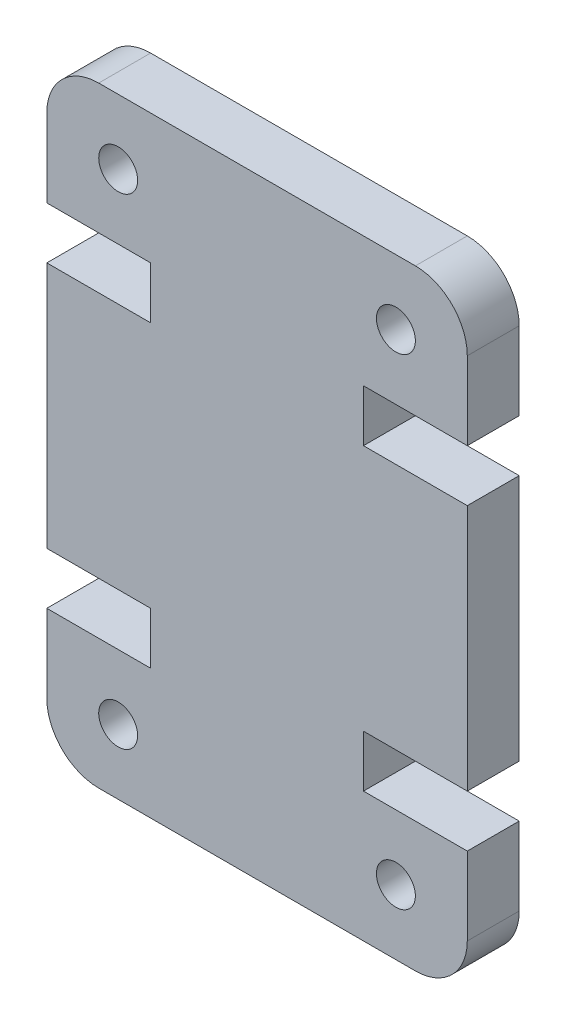
ISO-10303-21;
HEADER;
FILE_DESCRIPTION(('STEP AP214'),'2;1');
FILE_NAME('part.step','',(''),(''),'','','');
FILE_SCHEMA(('AUTOMOTIVE_DESIGN { 1 0 10303 214 1 1 1 1 }'));
ENDSEC;
DATA;
#1=APPLICATION_CONTEXT('core data for automotive mechanical design processes');
#2=APPLICATION_PROTOCOL_DEFINITION('international standard','automotive_design',2000,#1);
#3=PRODUCT_CONTEXT('',#1,'mechanical');
#4=PRODUCT('Part','Part','',(#3));
#5=PRODUCT_RELATED_PRODUCT_CATEGORY('part','',(#4));
#6=PRODUCT_DEFINITION_FORMATION('','',#4);
#7=PRODUCT_DEFINITION_CONTEXT('part definition',#1,'design');
#8=PRODUCT_DEFINITION('design','',#6,#7);
#9=PRODUCT_DEFINITION_SHAPE('','',#8);
#10=(LENGTH_UNIT() NAMED_UNIT(*) SI_UNIT(.MILLI.,.METRE.));
#11=(NAMED_UNIT(*) PLANE_ANGLE_UNIT() SI_UNIT($,.RADIAN.));
#12=(NAMED_UNIT(*) SI_UNIT($,.STERADIAN.) SOLID_ANGLE_UNIT());
#13=UNCERTAINTY_MEASURE_WITH_UNIT(LENGTH_MEASURE(1.E-05),#10,'distance_accuracy_value','');
#14=(GEOMETRIC_REPRESENTATION_CONTEXT(3) GLOBAL_UNCERTAINTY_ASSIGNED_CONTEXT((#13)) GLOBAL_UNIT_ASSIGNED_CONTEXT((#10,
#11,#12)) REPRESENTATION_CONTEXT('',''));
#15=CARTESIAN_POINT('',(0.,0.,0.));
#16=DIRECTION('',(0.,0.,1.));
#17=DIRECTION('',(1.,0.,0.));
#18=AXIS2_PLACEMENT_3D('',#15,#16,#17);
#19=CARTESIAN_POINT('',(14.2,2.,2.));
#20=DIRECTION('',(0.,0.,-1.));
#21=DIRECTION('',(-1.,0.,0.));
#22=AXIS2_PLACEMENT_3D('',#19,#20,#21);
#23=PLANE('',#22);
#24=CARTESIAN_POINT('',(13.4499999999986,21.0250000000001,2.));
#25=DIRECTION('',(0.,0.,1.));
#26=DIRECTION('',(1.,0.,0.));
#27=AXIS2_PLACEMENT_3D('',#24,#25,#26);
#28=CIRCLE('',#27,0.750000000000004);
#29=CARTESIAN_POINT('',(14.1999999999986,21.0250000000001,2.));
#30=VERTEX_POINT('',#29);
#31=EDGE_CURVE('E448',#30,#30,#28,.T.);
#32=ORIENTED_EDGE('',*,*,#31,.F.);
#33=EDGE_LOOP('',(#32));
#34=FACE_BOUND('',#33,.T.);
#35=CARTESIAN_POINT('',(13.4499999999986,2.4999999999999,2.));
#36=DIRECTION('',(0.,0.,1.));
#37=DIRECTION('',(-1.,0.,0.));
#38=AXIS2_PLACEMENT_3D('',#35,#36,#37);
#39=CIRCLE('',#38,0.750000000000004);
#40=CARTESIAN_POINT('',(12.6999999999986,2.4999999999999,2.));
#41=VERTEX_POINT('',#40);
#42=EDGE_CURVE('E230',#41,#41,#39,.T.);
#43=ORIENTED_EDGE('',*,*,#42,.F.);
#44=EDGE_LOOP('',(#43));
#45=FACE_BOUND('',#44,.T.);
#46=CARTESIAN_POINT('',(14.2,2.,2.));
#47=DIRECTION('',(0.,0.,1.));
#48=DIRECTION('',(-1.,0.,0.));
#49=AXIS2_PLACEMENT_3D('',#46,#47,#48);
#50=CIRCLE('',#49,2.);
#51=CARTESIAN_POINT('',(14.2,0.,2.));
#52=VERTEX_POINT('',#51);
#53=CARTESIAN_POINT('',(16.2,2.,2.));
#54=VERTEX_POINT('',#53);
#55=EDGE_CURVE('E273',#52,#54,#50,.T.);
#56=ORIENTED_EDGE('',*,*,#55,.T.);
#57=DIRECTION('',(0.,1.,0.));
#58=VECTOR('',#57,1.);
#59=CARTESIAN_POINT('',(16.2,5.00000000000014,2.));
#60=LINE('',#59,#58);
#61=CARTESIAN_POINT('',(16.2,5.00000000000014,2.));
#62=VERTEX_POINT('',#61);
#63=EDGE_CURVE('E141',#54,#62,#60,.T.);
#64=ORIENTED_EDGE('',*,*,#63,.T.);
#65=DIRECTION('',(-1.,0.,0.));
#66=VECTOR('',#65,1.);
#67=CARTESIAN_POINT('',(12.2,5.00000000000014,2.));
#68=LINE('',#67,#66);
#69=CARTESIAN_POINT('',(12.2,5.00000000000014,2.));
#70=VERTEX_POINT('',#69);
#71=EDGE_CURVE('E336',#62,#70,#68,.T.);
#72=ORIENTED_EDGE('',*,*,#71,.T.);
#73=DIRECTION('',(0.,1.,0.));
#74=VECTOR('',#73,1.);
#75=CARTESIAN_POINT('',(12.2,7.00000000000014,2.));
#76=LINE('',#75,#74);
#77=CARTESIAN_POINT('',(12.2,7.00000000000014,2.));
#78=VERTEX_POINT('',#77);
#79=EDGE_CURVE('E355',#70,#78,#76,.T.);
#80=ORIENTED_EDGE('',*,*,#79,.T.);
#81=DIRECTION('',(1.,0.,0.));
#82=VECTOR('',#81,1.);
#83=CARTESIAN_POINT('',(16.2,7.00000000000014,2.));
#84=LINE('',#83,#82);
#85=CARTESIAN_POINT('',(16.2,7.00000000000014,2.));
#86=VERTEX_POINT('',#85);
#87=EDGE_CURVE('E352',#78,#86,#84,.T.);
#88=ORIENTED_EDGE('',*,*,#87,.T.);
#89=DIRECTION('',(0.,1.,0.));
#90=VECTOR('',#89,1.);
#91=CARTESIAN_POINT('',(16.2,7.00000000000014,2.));
#92=LINE('',#91,#90);
#93=CARTESIAN_POINT('',(16.2,16.5249999999999,2.));
#94=VERTEX_POINT('',#93);
#95=EDGE_CURVE('E354',#86,#94,#92,.T.);
#96=ORIENTED_EDGE('',*,*,#95,.T.);
#97=DIRECTION('',(-1.,0.,0.));
#98=VECTOR('',#97,1.);
#99=CARTESIAN_POINT('',(16.2,16.5249999999999,2.));
#100=LINE('',#99,#98);
#101=CARTESIAN_POINT('',(12.2,16.5249999999999,2.));
#102=VERTEX_POINT('',#101);
#103=EDGE_CURVE('E357',#94,#102,#100,.T.);
#104=ORIENTED_EDGE('',*,*,#103,.T.);
#105=DIRECTION('',(0.,1.,0.));
#106=VECTOR('',#105,1.);
#107=CARTESIAN_POINT('',(12.2,16.5249999999999,2.));
#108=LINE('',#107,#106);
#109=CARTESIAN_POINT('',(12.2,18.5249999999999,2.));
#110=VERTEX_POINT('',#109);
#111=EDGE_CURVE('E363',#102,#110,#108,.T.);
#112=ORIENTED_EDGE('',*,*,#111,.T.);
#113=DIRECTION('',(1.,0.,0.));
#114=VECTOR('',#113,1.);
#115=CARTESIAN_POINT('',(12.2,18.5249999999999,2.));
#116=LINE('',#115,#114);
#117=CARTESIAN_POINT('',(16.2,18.5249999999999,2.));
#118=VERTEX_POINT('',#117);
#119=EDGE_CURVE('E365',#110,#118,#116,.T.);
#120=ORIENTED_EDGE('',*,*,#119,.T.);
#121=DIRECTION('',(0.,1.,0.));
#122=VECTOR('',#121,1.);
#123=CARTESIAN_POINT('',(16.2,18.5249999999999,2.));
#124=LINE('',#123,#122);
#125=CARTESIAN_POINT('',(16.2,21.525,2.));
#126=VERTEX_POINT('',#125);
#127=EDGE_CURVE('E367',#118,#126,#124,.T.);
#128=ORIENTED_EDGE('',*,*,#127,.T.);
#129=CARTESIAN_POINT('',(14.2,21.525,2.));
#130=DIRECTION('',(0.,0.,1.));
#131=DIRECTION('',(1.,0.,0.));
#132=AXIS2_PLACEMENT_3D('',#129,#130,#131);
#133=CIRCLE('',#132,2.);
#134=CARTESIAN_POINT('',(14.2,23.525,2.));
#135=VERTEX_POINT('',#134);
#136=EDGE_CURVE('E369',#126,#135,#133,.T.);
#137=ORIENTED_EDGE('',*,*,#136,.T.);
#138=DIRECTION('',(-1.,0.,0.));
#139=VECTOR('',#138,1.);
#140=CARTESIAN_POINT('',(1.99999999999999,23.525,2.));
#141=LINE('',#140,#139);
#142=CARTESIAN_POINT('',(1.99999999999999,23.525,2.));
#143=VERTEX_POINT('',#142);
#144=EDGE_CURVE('E371',#135,#143,#141,.T.);
#145=ORIENTED_EDGE('',*,*,#144,.T.);
#146=CARTESIAN_POINT('',(2.,21.525,2.));
#147=DIRECTION('',(0.,0.,1.));
#148=DIRECTION('',(-1.,0.,0.));
#149=AXIS2_PLACEMENT_3D('',#146,#147,#148);
#150=CIRCLE('',#149,2.);
#151=CARTESIAN_POINT('',(0.,21.525,2.));
#152=VERTEX_POINT('',#151);
#153=EDGE_CURVE('E373',#143,#152,#150,.T.);
#154=ORIENTED_EDGE('',*,*,#153,.T.);
#155=DIRECTION('',(0.,-1.,0.));
#156=VECTOR('',#155,1.);
#157=CARTESIAN_POINT('',(0.,18.5249999999999,2.));
#158=LINE('',#157,#156);
#159=CARTESIAN_POINT('',(0.,18.5249999999999,2.));
#160=VERTEX_POINT('',#159);
#161=EDGE_CURVE('E375',#152,#160,#158,.T.);
#162=ORIENTED_EDGE('',*,*,#161,.T.);
#163=DIRECTION('',(1.,0.,0.));
#164=VECTOR('',#163,1.);
#165=CARTESIAN_POINT('',(4.,18.5249999999999,2.));
#166=LINE('',#165,#164);
#167=CARTESIAN_POINT('',(4.,18.5249999999999,2.));
#168=VERTEX_POINT('',#167);
#169=EDGE_CURVE('E377',#160,#168,#166,.T.);
#170=ORIENTED_EDGE('',*,*,#169,.T.);
#171=DIRECTION('',(0.,-1.,0.));
#172=VECTOR('',#171,1.);
#173=CARTESIAN_POINT('',(4.,16.5249999999999,2.));
#174=LINE('',#173,#172);
#175=CARTESIAN_POINT('',(4.,16.5249999999999,2.));
#176=VERTEX_POINT('',#175);
#177=EDGE_CURVE('E379',#168,#176,#174,.T.);
#178=ORIENTED_EDGE('',*,*,#177,.T.);
#179=DIRECTION('',(-1.,0.,0.));
#180=VECTOR('',#179,1.);
#181=CARTESIAN_POINT('',(0.,16.5249999999999,2.));
#182=LINE('',#181,#180);
#183=CARTESIAN_POINT('',(0.,16.5249999999999,2.));
#184=VERTEX_POINT('',#183);
#185=EDGE_CURVE('E381',#176,#184,#182,.T.);
#186=ORIENTED_EDGE('',*,*,#185,.T.);
#187=DIRECTION('',(0.,-1.,0.));
#188=VECTOR('',#187,1.);
#189=CARTESIAN_POINT('',(0.,7.00000000000012,2.));
#190=LINE('',#189,#188);
#191=CARTESIAN_POINT('',(0.,7.00000000000012,2.));
#192=VERTEX_POINT('',#191);
#193=EDGE_CURVE('E383',#184,#192,#190,.T.);
#194=ORIENTED_EDGE('',*,*,#193,.T.);
#195=DIRECTION('',(1.,0.,0.));
#196=VECTOR('',#195,1.);
#197=CARTESIAN_POINT('',(0.,7.00000000000012,2.));
#198=LINE('',#197,#196);
#199=CARTESIAN_POINT('',(4.,7.00000000000014,2.));
#200=VERTEX_POINT('',#199);
#201=EDGE_CURVE('E385',#192,#200,#198,.T.);
#202=ORIENTED_EDGE('',*,*,#201,.T.);
#203=DIRECTION('',(0.,-1.,0.));
#204=VECTOR('',#203,1.);
#205=CARTESIAN_POINT('',(4.,7.00000000000014,2.));
#206=LINE('',#205,#204);
#207=CARTESIAN_POINT('',(4.,5.00000000000014,2.));
#208=VERTEX_POINT('',#207);
#209=EDGE_CURVE('E387',#200,#208,#206,.T.);
#210=ORIENTED_EDGE('',*,*,#209,.T.);
#211=DIRECTION('',(-1.,0.,0.));
#212=VECTOR('',#211,1.);
#213=CARTESIAN_POINT('',(4.,5.00000000000014,2.));
#214=LINE('',#213,#212);
#215=CARTESIAN_POINT('',(0.,5.00000000000014,2.));
#216=VERTEX_POINT('',#215);
#217=EDGE_CURVE('E208',#208,#216,#214,.T.);
#218=ORIENTED_EDGE('',*,*,#217,.T.);
#219=DIRECTION('',(0.,-1.,0.));
#220=VECTOR('',#219,1.);
#221=CARTESIAN_POINT('',(0.,5.00000000000014,2.));
#222=LINE('',#221,#220);
#223=CARTESIAN_POINT('',(0.,2.00000000000002,2.));
#224=VERTEX_POINT('',#223);
#225=EDGE_CURVE('E202',#216,#224,#222,.T.);
#226=ORIENTED_EDGE('',*,*,#225,.T.);
#227=CARTESIAN_POINT('',(2.,2.,2.));
#228=DIRECTION('',(0.,0.,1.));
#229=DIRECTION('',(1.,0.,0.));
#230=AXIS2_PLACEMENT_3D('',#227,#228,#229);
#231=CIRCLE('',#230,2.);
#232=CARTESIAN_POINT('',(2.,0.,2.));
#233=VERTEX_POINT('',#232);
#234=EDGE_CURVE('E206',#224,#233,#231,.T.);
#235=ORIENTED_EDGE('',*,*,#234,.T.);
#236=DIRECTION('',(1.,0.,0.));
#237=VECTOR('',#236,1.);
#238=CARTESIAN_POINT('',(2.,0.,2.));
#239=LINE('',#238,#237);
#240=EDGE_CURVE('E50',#233,#52,#239,.T.);
#241=ORIENTED_EDGE('',*,*,#240,.T.);
#242=EDGE_LOOP('',(#56,#64,#72,#80,#88,#96,#104,#112,#120,#128,#137,#145,#154,#162,#170,#178,
#186,#194,#202,#210,#218,#226,#235,#241));
#243=FACE_BOUND('',#242,.T.);
#244=CARTESIAN_POINT('',(2.75000000000137,21.0250000000001,2.));
#245=DIRECTION('',(0.,0.,1.));
#246=DIRECTION('',(-1.,0.,0.));
#247=AXIS2_PLACEMENT_3D('',#244,#245,#246);
#248=CIRCLE('',#247,0.749999999999999);
#249=CARTESIAN_POINT('',(2.00000000000137,21.0250000000001,2.));
#250=VERTEX_POINT('',#249);
#251=EDGE_CURVE('E454',#250,#250,#248,.T.);
#252=ORIENTED_EDGE('',*,*,#251,.F.);
#253=EDGE_LOOP('',(#252));
#254=FACE_BOUND('',#253,.T.);
#255=CARTESIAN_POINT('',(2.75000000000138,2.4999999999999,2.));
#256=DIRECTION('',(0.,0.,1.));
#257=DIRECTION('',(1.,0.,0.));
#258=AXIS2_PLACEMENT_3D('',#255,#256,#257);
#259=CIRCLE('',#258,0.75);
#260=CARTESIAN_POINT('',(3.50000000000138,2.4999999999999,2.));
#261=VERTEX_POINT('',#260);
#262=EDGE_CURVE('E439',#261,#261,#259,.T.);
#263=ORIENTED_EDGE('',*,*,#262,.F.);
#264=EDGE_LOOP('',(#263));
#265=FACE_BOUND('',#264,.T.);
#266=ADVANCED_FACE('F33',(#34,#45,#243,#254,#265),#23,.F.);
#267=CARTESIAN_POINT('',(14.2,2.,0.));
#268=DIRECTION('',(0.,0.,-1.));
#269=DIRECTION('',(-1.,0.,0.));
#270=AXIS2_PLACEMENT_3D('',#267,#268,#269);
#271=PLANE('',#270);
#272=CARTESIAN_POINT('',(13.4499999999986,21.0250000000001,0.));
#273=DIRECTION('',(0.,0.,1.));
#274=DIRECTION('',(1.,0.,0.));
#275=AXIS2_PLACEMENT_3D('',#272,#273,#274);
#276=CIRCLE('',#275,0.750000000000004);
#277=CARTESIAN_POINT('',(14.1999999999986,21.0250000000001,0.));
#278=VERTEX_POINT('',#277);
#279=EDGE_CURVE('E445',#278,#278,#276,.T.);
#280=ORIENTED_EDGE('',*,*,#279,.T.);
#281=EDGE_LOOP('',(#280));
#282=FACE_BOUND('',#281,.T.);
#283=CARTESIAN_POINT('',(13.4499999999986,2.4999999999999,0.));
#284=DIRECTION('',(0.,0.,1.));
#285=DIRECTION('',(-1.,0.,0.));
#286=AXIS2_PLACEMENT_3D('',#283,#284,#285);
#287=CIRCLE('',#286,0.750000000000004);
#288=CARTESIAN_POINT('',(12.6999999999986,2.4999999999999,0.));
#289=VERTEX_POINT('',#288);
#290=EDGE_CURVE('E457',#289,#289,#287,.T.);
#291=ORIENTED_EDGE('',*,*,#290,.T.);
#292=EDGE_LOOP('',(#291));
#293=FACE_BOUND('',#292,.T.);
#294=CARTESIAN_POINT('',(14.2,2.,0.));
#295=DIRECTION('',(0.,0.,1.));
#296=DIRECTION('',(-1.,0.,0.));
#297=AXIS2_PLACEMENT_3D('',#294,#295,#296);
#298=CIRCLE('',#297,2.);
#299=CARTESIAN_POINT('',(14.2,0.,0.));
#300=VERTEX_POINT('',#299);
#301=CARTESIAN_POINT('',(16.2,2.,0.));
#302=VERTEX_POINT('',#301);
#303=EDGE_CURVE('E226',#300,#302,#298,.T.);
#304=ORIENTED_EDGE('',*,*,#303,.F.);
#305=DIRECTION('',(1.,0.,0.));
#306=VECTOR('',#305,1.);
#307=CARTESIAN_POINT('',(2.,0.,0.));
#308=LINE('',#307,#306);
#309=CARTESIAN_POINT('',(2.,0.,0.));
#310=VERTEX_POINT('',#309);
#311=EDGE_CURVE('E133',#310,#300,#308,.T.);
#312=ORIENTED_EDGE('',*,*,#311,.F.);
#313=CARTESIAN_POINT('',(2.,2.,0.));
#314=DIRECTION('',(0.,0.,1.));
#315=DIRECTION('',(1.,0.,0.));
#316=AXIS2_PLACEMENT_3D('',#313,#314,#315);
#317=CIRCLE('',#316,2.);
#318=CARTESIAN_POINT('',(0.,2.00000000000002,0.));
#319=VERTEX_POINT('',#318);
#320=EDGE_CURVE('E127',#319,#310,#317,.T.);
#321=ORIENTED_EDGE('',*,*,#320,.F.);
#322=DIRECTION('',(0.,-1.,0.));
#323=VECTOR('',#322,1.);
#324=CARTESIAN_POINT('',(0.,5.00000000000014,0.));
#325=LINE('',#324,#323);
#326=CARTESIAN_POINT('',(0.,5.00000000000014,0.));
#327=VERTEX_POINT('',#326);
#328=EDGE_CURVE('E216',#327,#319,#325,.T.);
#329=ORIENTED_EDGE('',*,*,#328,.F.);
#330=DIRECTION('',(-1.,0.,0.));
#331=VECTOR('',#330,1.);
#332=CARTESIAN_POINT('',(4.,5.00000000000014,0.));
#333=LINE('',#332,#331);
#334=CARTESIAN_POINT('',(4.,5.00000000000014,0.));
#335=VERTEX_POINT('',#334);
#336=EDGE_CURVE('E268',#335,#327,#333,.T.);
#337=ORIENTED_EDGE('',*,*,#336,.F.);
#338=DIRECTION('',(0.,-1.,0.));
#339=VECTOR('',#338,1.);
#340=CARTESIAN_POINT('',(4.,7.00000000000014,0.));
#341=LINE('',#340,#339);
#342=CARTESIAN_POINT('',(4.,7.00000000000014,0.));
#343=VERTEX_POINT('',#342);
#344=EDGE_CURVE('E266',#343,#335,#341,.T.);
#345=ORIENTED_EDGE('',*,*,#344,.F.);
#346=DIRECTION('',(1.,0.,0.));
#347=VECTOR('',#346,1.);
#348=CARTESIAN_POINT('',(0.,7.00000000000012,0.));
#349=LINE('',#348,#347);
#350=CARTESIAN_POINT('',(0.,7.00000000000012,0.));
#351=VERTEX_POINT('',#350);
#352=EDGE_CURVE('E264',#351,#343,#349,.T.);
#353=ORIENTED_EDGE('',*,*,#352,.F.);
#354=DIRECTION('',(0.,-1.,0.));
#355=VECTOR('',#354,1.);
#356=CARTESIAN_POINT('',(0.,7.00000000000012,0.));
#357=LINE('',#356,#355);
#358=CARTESIAN_POINT('',(0.,16.5249999999999,0.));
#359=VERTEX_POINT('',#358);
#360=EDGE_CURVE('E262',#359,#351,#357,.T.);
#361=ORIENTED_EDGE('',*,*,#360,.F.);
#362=DIRECTION('',(-1.,0.,0.));
#363=VECTOR('',#362,1.);
#364=CARTESIAN_POINT('',(0.,16.5249999999999,0.));
#365=LINE('',#364,#363);
#366=CARTESIAN_POINT('',(4.,16.5249999999999,0.));
#367=VERTEX_POINT('',#366);
#368=EDGE_CURVE('E260',#367,#359,#365,.T.);
#369=ORIENTED_EDGE('',*,*,#368,.F.);
#370=DIRECTION('',(0.,-1.,0.));
#371=VECTOR('',#370,1.);
#372=CARTESIAN_POINT('',(4.,16.5249999999999,0.));
#373=LINE('',#372,#371);
#374=CARTESIAN_POINT('',(4.,18.5249999999999,0.));
#375=VERTEX_POINT('',#374);
#376=EDGE_CURVE('E258',#375,#367,#373,.T.);
#377=ORIENTED_EDGE('',*,*,#376,.F.);
#378=DIRECTION('',(1.,0.,0.));
#379=VECTOR('',#378,1.);
#380=CARTESIAN_POINT('',(4.,18.5249999999999,0.));
#381=LINE('',#380,#379);
#382=CARTESIAN_POINT('',(0.,18.5249999999999,0.));
#383=VERTEX_POINT('',#382);
#384=EDGE_CURVE('E256',#383,#375,#381,.T.);
#385=ORIENTED_EDGE('',*,*,#384,.F.);
#386=DIRECTION('',(0.,-1.,0.));
#387=VECTOR('',#386,1.);
#388=CARTESIAN_POINT('',(0.,18.5249999999999,0.));
#389=LINE('',#388,#387);
#390=CARTESIAN_POINT('',(0.,21.525,0.));
#391=VERTEX_POINT('',#390);
#392=EDGE_CURVE('E254',#391,#383,#389,.T.);
#393=ORIENTED_EDGE('',*,*,#392,.F.);
#394=CARTESIAN_POINT('',(2.,21.525,0.));
#395=DIRECTION('',(0.,0.,1.));
#396=DIRECTION('',(-1.,0.,0.));
#397=AXIS2_PLACEMENT_3D('',#394,#395,#396);
#398=CIRCLE('',#397,2.);
#399=CARTESIAN_POINT('',(1.99999999999999,23.525,0.));
#400=VERTEX_POINT('',#399);
#401=EDGE_CURVE('E252',#400,#391,#398,.T.);
#402=ORIENTED_EDGE('',*,*,#401,.F.);
#403=DIRECTION('',(-1.,0.,0.));
#404=VECTOR('',#403,1.);
#405=CARTESIAN_POINT('',(1.99999999999999,23.525,0.));
#406=LINE('',#405,#404);
#407=CARTESIAN_POINT('',(14.2,23.525,0.));
#408=VERTEX_POINT('',#407);
#409=EDGE_CURVE('E250',#408,#400,#406,.T.);
#410=ORIENTED_EDGE('',*,*,#409,.F.);
#411=CARTESIAN_POINT('',(14.2,21.525,0.));
#412=DIRECTION('',(0.,0.,1.));
#413=DIRECTION('',(1.,0.,0.));
#414=AXIS2_PLACEMENT_3D('',#411,#412,#413);
#415=CIRCLE('',#414,2.);
#416=CARTESIAN_POINT('',(16.2,21.525,0.));
#417=VERTEX_POINT('',#416);
#418=EDGE_CURVE('E248',#417,#408,#415,.T.);
#419=ORIENTED_EDGE('',*,*,#418,.F.);
#420=DIRECTION('',(0.,1.,0.));
#421=VECTOR('',#420,1.);
#422=CARTESIAN_POINT('',(16.2,18.5249999999999,0.));
#423=LINE('',#422,#421);
#424=CARTESIAN_POINT('',(16.2,18.5249999999999,0.));
#425=VERTEX_POINT('',#424);
#426=EDGE_CURVE('E246',#425,#417,#423,.T.);
#427=ORIENTED_EDGE('',*,*,#426,.F.);
#428=DIRECTION('',(1.,0.,0.));
#429=VECTOR('',#428,1.);
#430=CARTESIAN_POINT('',(12.2,18.5249999999999,0.));
#431=LINE('',#430,#429);
#432=CARTESIAN_POINT('',(12.2,18.5249999999999,0.));
#433=VERTEX_POINT('',#432);
#434=EDGE_CURVE('E244',#433,#425,#431,.T.);
#435=ORIENTED_EDGE('',*,*,#434,.F.);
#436=DIRECTION('',(0.,1.,0.));
#437=VECTOR('',#436,1.);
#438=CARTESIAN_POINT('',(12.2,16.5249999999999,0.));
#439=LINE('',#438,#437);
#440=CARTESIAN_POINT('',(12.2,16.5249999999999,0.));
#441=VERTEX_POINT('',#440);
#442=EDGE_CURVE('E242',#441,#433,#439,.T.);
#443=ORIENTED_EDGE('',*,*,#442,.F.);
#444=DIRECTION('',(-1.,0.,0.));
#445=VECTOR('',#444,1.);
#446=CARTESIAN_POINT('',(16.2,16.5249999999999,0.));
#447=LINE('',#446,#445);
#448=CARTESIAN_POINT('',(16.2,16.5249999999999,0.));
#449=VERTEX_POINT('',#448);
#450=EDGE_CURVE('E240',#449,#441,#447,.T.);
#451=ORIENTED_EDGE('',*,*,#450,.F.);
#452=DIRECTION('',(0.,1.,0.));
#453=VECTOR('',#452,1.);
#454=CARTESIAN_POINT('',(16.2,7.00000000000014,0.));
#455=LINE('',#454,#453);
#456=CARTESIAN_POINT('',(16.2,7.00000000000014,0.));
#457=VERTEX_POINT('',#456);
#458=EDGE_CURVE('E238',#457,#449,#455,.T.);
#459=ORIENTED_EDGE('',*,*,#458,.F.);
#460=DIRECTION('',(1.,0.,0.));
#461=VECTOR('',#460,1.);
#462=CARTESIAN_POINT('',(16.2,7.00000000000014,0.));
#463=LINE('',#462,#461);
#464=CARTESIAN_POINT('',(12.2,7.00000000000014,0.));
#465=VERTEX_POINT('',#464);
#466=EDGE_CURVE('E236',#465,#457,#463,.T.);
#467=ORIENTED_EDGE('',*,*,#466,.F.);
#468=DIRECTION('',(0.,1.,0.));
#469=VECTOR('',#468,1.);
#470=CARTESIAN_POINT('',(12.2,7.00000000000014,0.));
#471=LINE('',#470,#469);
#472=CARTESIAN_POINT('',(12.2,5.00000000000014,0.));
#473=VERTEX_POINT('',#472);
#474=EDGE_CURVE('E234',#473,#465,#471,.T.);
#475=ORIENTED_EDGE('',*,*,#474,.F.);
#476=DIRECTION('',(-1.,0.,0.));
#477=VECTOR('',#476,1.);
#478=CARTESIAN_POINT('',(12.2,5.00000000000014,0.));
#479=LINE('',#478,#477);
#480=CARTESIAN_POINT('',(16.2,5.00000000000014,0.));
#481=VERTEX_POINT('',#480);
#482=EDGE_CURVE('E232',#481,#473,#479,.T.);
#483=ORIENTED_EDGE('',*,*,#482,.F.);
#484=DIRECTION('',(0.,1.,0.));
#485=VECTOR('',#484,1.);
#486=CARTESIAN_POINT('',(16.2,5.00000000000014,0.));
#487=LINE('',#486,#485);
#488=EDGE_CURVE('E229',#302,#481,#487,.T.);
#489=ORIENTED_EDGE('',*,*,#488,.F.);
#490=EDGE_LOOP('',(#304,#312,#321,#329,#337,#345,#353,#361,#369,#377,#385,#393,#402,#410,#419,
#427,#435,#443,#451,#459,#467,#475,#483,#489));
#491=FACE_BOUND('',#490,.T.);
#492=CARTESIAN_POINT('',(2.75000000000137,21.0250000000001,0.));
#493=DIRECTION('',(0.,0.,1.));
#494=DIRECTION('',(-1.,0.,0.));
#495=AXIS2_PLACEMENT_3D('',#492,#493,#494);
#496=CIRCLE('',#495,0.749999999999999);
#497=CARTESIAN_POINT('',(2.00000000000137,21.0250000000001,0.));
#498=VERTEX_POINT('',#497);
#499=EDGE_CURVE('E451',#498,#498,#496,.T.);
#500=ORIENTED_EDGE('',*,*,#499,.T.);
#501=EDGE_LOOP('',(#500));
#502=FACE_BOUND('',#501,.T.);
#503=CARTESIAN_POINT('',(2.75000000000138,2.4999999999999,0.));
#504=DIRECTION('',(0.,0.,1.));
#505=DIRECTION('',(1.,0.,0.));
#506=AXIS2_PLACEMENT_3D('',#503,#504,#505);
#507=CIRCLE('',#506,0.75);
#508=CARTESIAN_POINT('',(3.50000000000138,2.4999999999999,0.));
#509=VERTEX_POINT('',#508);
#510=EDGE_CURVE('E442',#509,#509,#507,.T.);
#511=ORIENTED_EDGE('',*,*,#510,.T.);
#512=EDGE_LOOP('',(#511));
#513=FACE_BOUND('',#512,.T.);
#514=ADVANCED_FACE('F340',(#282,#293,#491,#502,#513),#271,.T.);
#515=CARTESIAN_POINT('',(14.2,2.,2.));
#516=DIRECTION('',(0.,0.,-1.));
#517=DIRECTION('',(-1.,0.,0.));
#518=AXIS2_PLACEMENT_3D('',#515,#516,#517);
#519=CYLINDRICAL_SURFACE('',#518,2.);
#520=ORIENTED_EDGE('',*,*,#303,.T.);
#521=DIRECTION('',(0.,0.,-1.));
#522=VECTOR('',#521,1.);
#523=CARTESIAN_POINT('',(16.2,2.,2.));
#524=LINE('',#523,#522);
#525=EDGE_CURVE('E11',#54,#302,#524,.T.);
#526=ORIENTED_EDGE('',*,*,#525,.F.);
#527=ORIENTED_EDGE('',*,*,#55,.F.);
#528=DIRECTION('',(0.,0.,-1.));
#529=VECTOR('',#528,1.);
#530=CARTESIAN_POINT('',(14.2,0.,2.));
#531=LINE('',#530,#529);
#532=EDGE_CURVE('E222',#52,#300,#531,.T.);
#533=ORIENTED_EDGE('',*,*,#532,.T.);
#534=EDGE_LOOP('',(#520,#526,#527,#533));
#535=FACE_BOUND('',#534,.T.);
#536=ADVANCED_FACE('F35',(#535),#519,.T.);
#537=CARTESIAN_POINT('',(16.2,5.00000000000014,2.));
#538=DIRECTION('',(-1.,0.,0.));
#539=DIRECTION('',(0.,-1.,0.));
#540=AXIS2_PLACEMENT_3D('',#537,#538,#539);
#541=PLANE('',#540);
#542=ORIENTED_EDGE('',*,*,#488,.T.);
#543=DIRECTION('',(0.,0.,-1.));
#544=VECTOR('',#543,1.);
#545=CARTESIAN_POINT('',(16.2,5.00000000000014,2.));
#546=LINE('',#545,#544);
#547=EDGE_CURVE('E42',#62,#481,#546,.T.);
#548=ORIENTED_EDGE('',*,*,#547,.F.);
#549=ORIENTED_EDGE('',*,*,#63,.F.);
#550=ORIENTED_EDGE('',*,*,#525,.T.);
#551=EDGE_LOOP('',(#542,#548,#549,#550));
#552=FACE_BOUND('',#551,.T.);
#553=ADVANCED_FACE('F686',(#552),#541,.F.);
#554=CARTESIAN_POINT('',(12.2,5.00000000000014,2.));
#555=DIRECTION('',(0.,-1.,0.));
#556=DIRECTION('',(0.,0.,-1.));
#557=AXIS2_PLACEMENT_3D('',#554,#555,#556);
#558=PLANE('',#557);
#559=ORIENTED_EDGE('',*,*,#482,.T.);
#560=DIRECTION('',(0.,0.,-1.));
#561=VECTOR('',#560,1.);
#562=CARTESIAN_POINT('',(12.2,5.00000000000014,2.));
#563=LINE('',#562,#561);
#564=EDGE_CURVE('E328',#70,#473,#563,.T.);
#565=ORIENTED_EDGE('',*,*,#564,.F.);
#566=ORIENTED_EDGE('',*,*,#71,.F.);
#567=ORIENTED_EDGE('',*,*,#547,.T.);
#568=EDGE_LOOP('',(#559,#565,#566,#567));
#569=FACE_BOUND('',#568,.T.);
#570=ADVANCED_FACE('F334',(#569),#558,.F.);
#571=CARTESIAN_POINT('',(12.2,7.00000000000014,2.));
#572=DIRECTION('',(-1.,0.,0.));
#573=DIRECTION('',(0.,0.,1.));
#574=AXIS2_PLACEMENT_3D('',#571,#572,#573);
#575=PLANE('',#574);
#576=ORIENTED_EDGE('',*,*,#474,.T.);
#577=DIRECTION('',(0.,0.,-1.));
#578=VECTOR('',#577,1.);
#579=CARTESIAN_POINT('',(12.2,7.00000000000014,2.));
#580=LINE('',#579,#578);
#581=EDGE_CURVE('E325',#78,#465,#580,.T.);
#582=ORIENTED_EDGE('',*,*,#581,.F.);
#583=ORIENTED_EDGE('',*,*,#79,.F.);
#584=ORIENTED_EDGE('',*,*,#564,.T.);
#585=EDGE_LOOP('',(#576,#582,#583,#584));
#586=FACE_BOUND('',#585,.T.);
#587=ADVANCED_FACE('F346',(#586),#575,.F.);
#588=CARTESIAN_POINT('',(16.2,7.00000000000014,2.));
#589=DIRECTION('',(0.,1.,0.));
#590=DIRECTION('',(-1.,0.,0.));
#591=AXIS2_PLACEMENT_3D('',#588,#589,#590);
#592=PLANE('',#591);
#593=ORIENTED_EDGE('',*,*,#466,.T.);
#594=DIRECTION('',(0.,0.,-1.));
#595=VECTOR('',#594,1.);
#596=CARTESIAN_POINT('',(16.2,7.00000000000014,2.));
#597=LINE('',#596,#595);
#598=EDGE_CURVE('E322',#86,#457,#597,.T.);
#599=ORIENTED_EDGE('',*,*,#598,.F.);
#600=ORIENTED_EDGE('',*,*,#87,.F.);
#601=ORIENTED_EDGE('',*,*,#581,.T.);
#602=EDGE_LOOP('',(#593,#599,#600,#601));
#603=FACE_BOUND('',#602,.T.);
#604=ADVANCED_FACE('F350',(#603),#592,.F.);
#605=CARTESIAN_POINT('',(16.2,7.00000000000014,2.));
#606=DIRECTION('',(-1.,0.,0.));
#607=DIRECTION('',(0.,0.,1.));
#608=AXIS2_PLACEMENT_3D('',#605,#606,#607);
#609=PLANE('',#608);
#610=ORIENTED_EDGE('',*,*,#458,.T.);
#611=DIRECTION('',(0.,0.,-1.));
#612=VECTOR('',#611,1.);
#613=CARTESIAN_POINT('',(16.2,16.5249999999999,2.));
#614=LINE('',#613,#612);
#615=EDGE_CURVE('E319',#94,#449,#614,.T.);
#616=ORIENTED_EDGE('',*,*,#615,.F.);
#617=ORIENTED_EDGE('',*,*,#95,.F.);
#618=ORIENTED_EDGE('',*,*,#598,.T.);
#619=EDGE_LOOP('',(#610,#616,#617,#618));
#620=FACE_BOUND('',#619,.T.);
#621=ADVANCED_FACE('F651',(#620),#609,.F.);
#622=CARTESIAN_POINT('',(16.2,16.5249999999999,2.));
#623=DIRECTION('',(0.,-1.,0.));
#624=DIRECTION('',(1.,0.,0.));
#625=AXIS2_PLACEMENT_3D('',#622,#623,#624);
#626=PLANE('',#625);
#627=ORIENTED_EDGE('',*,*,#450,.T.);
#628=DIRECTION('',(0.,0.,-1.));
#629=VECTOR('',#628,1.);
#630=CARTESIAN_POINT('',(12.2,16.5249999999999,2.));
#631=LINE('',#630,#629);
#632=EDGE_CURVE('E316',#102,#441,#631,.T.);
#633=ORIENTED_EDGE('',*,*,#632,.F.);
#634=ORIENTED_EDGE('',*,*,#103,.F.);
#635=ORIENTED_EDGE('',*,*,#615,.T.);
#636=EDGE_LOOP('',(#627,#633,#634,#635));
#637=FACE_BOUND('',#636,.T.);
#638=ADVANCED_FACE('F641',(#637),#626,.F.);
#639=CARTESIAN_POINT('',(12.2,16.5249999999999,2.));
#640=DIRECTION('',(-1.,0.,0.));
#641=DIRECTION('',(0.,0.,1.));
#642=AXIS2_PLACEMENT_3D('',#639,#640,#641);
#643=PLANE('',#642);
#644=ORIENTED_EDGE('',*,*,#442,.T.);
#645=DIRECTION('',(0.,0.,-1.));
#646=VECTOR('',#645,1.);
#647=CARTESIAN_POINT('',(12.2,18.5249999999999,2.));
#648=LINE('',#647,#646);
#649=EDGE_CURVE('E313',#110,#433,#648,.T.);
#650=ORIENTED_EDGE('',*,*,#649,.F.);
#651=ORIENTED_EDGE('',*,*,#111,.F.);
#652=ORIENTED_EDGE('',*,*,#632,.T.);
#653=EDGE_LOOP('',(#644,#650,#651,#652));
#654=FACE_BOUND('',#653,.T.);
#655=ADVANCED_FACE('F631',(#654),#643,.F.);
#656=CARTESIAN_POINT('',(12.2,18.5249999999999,2.));
#657=DIRECTION('',(0.,1.,0.));
#658=DIRECTION('',(0.,0.,1.));
#659=AXIS2_PLACEMENT_3D('',#656,#657,#658);
#660=PLANE('',#659);
#661=ORIENTED_EDGE('',*,*,#434,.T.);
#662=DIRECTION('',(0.,0.,-1.));
#663=VECTOR('',#662,1.);
#664=CARTESIAN_POINT('',(16.2,18.5249999999999,2.));
#665=LINE('',#664,#663);
#666=EDGE_CURVE('E310',#118,#425,#665,.T.);
#667=ORIENTED_EDGE('',*,*,#666,.F.);
#668=ORIENTED_EDGE('',*,*,#119,.F.);
#669=ORIENTED_EDGE('',*,*,#649,.T.);
#670=EDGE_LOOP('',(#661,#667,#668,#669));
#671=FACE_BOUND('',#670,.T.);
#672=ADVANCED_FACE('F621',(#671),#660,.F.);
#673=CARTESIAN_POINT('',(16.2,18.5249999999999,2.));
#674=DIRECTION('',(-1.,0.,0.));
#675=DIRECTION('',(0.,-1.,0.));
#676=AXIS2_PLACEMENT_3D('',#673,#674,#675);
#677=PLANE('',#676);
#678=ORIENTED_EDGE('',*,*,#426,.T.);
#679=DIRECTION('',(0.,0.,-1.));
#680=VECTOR('',#679,1.);
#681=CARTESIAN_POINT('',(16.2,21.525,2.));
#682=LINE('',#681,#680);
#683=EDGE_CURVE('E307',#126,#417,#682,.T.);
#684=ORIENTED_EDGE('',*,*,#683,.F.);
#685=ORIENTED_EDGE('',*,*,#127,.F.);
#686=ORIENTED_EDGE('',*,*,#666,.T.);
#687=EDGE_LOOP('',(#678,#684,#685,#686));
#688=FACE_BOUND('',#687,.T.);
#689=ADVANCED_FACE('F611',(#688),#677,.F.);
#690=CARTESIAN_POINT('',(14.2,21.525,2.));
#691=DIRECTION('',(0.,0.,-1.));
#692=DIRECTION('',(-1.,0.,0.));
#693=AXIS2_PLACEMENT_3D('',#690,#691,#692);
#694=CYLINDRICAL_SURFACE('',#693,2.);
#695=ORIENTED_EDGE('',*,*,#418,.T.);
#696=DIRECTION('',(0.,0.,-1.));
#697=VECTOR('',#696,1.);
#698=CARTESIAN_POINT('',(14.2,23.525,2.));
#699=LINE('',#698,#697);
#700=EDGE_CURVE('E304',#135,#408,#699,.T.);
#701=ORIENTED_EDGE('',*,*,#700,.F.);
#702=ORIENTED_EDGE('',*,*,#136,.F.);
#703=ORIENTED_EDGE('',*,*,#683,.T.);
#704=EDGE_LOOP('',(#695,#701,#702,#703));
#705=FACE_BOUND('',#704,.T.);
#706=ADVANCED_FACE('F601',(#705),#694,.T.);
#707=CARTESIAN_POINT('',(1.99999999999999,23.525,2.));
#708=DIRECTION('',(0.,-1.,0.));
#709=DIRECTION('',(0.,0.,-1.));
#710=AXIS2_PLACEMENT_3D('',#707,#708,#709);
#711=PLANE('',#710);
#712=ORIENTED_EDGE('',*,*,#409,.T.);
#713=DIRECTION('',(0.,0.,-1.));
#714=VECTOR('',#713,1.);
#715=CARTESIAN_POINT('',(1.99999999999999,23.525,2.));
#716=LINE('',#715,#714);
#717=EDGE_CURVE('E301',#143,#400,#716,.T.);
#718=ORIENTED_EDGE('',*,*,#717,.F.);
#719=ORIENTED_EDGE('',*,*,#144,.F.);
#720=ORIENTED_EDGE('',*,*,#700,.T.);
#721=EDGE_LOOP('',(#712,#718,#719,#720));
#722=FACE_BOUND('',#721,.T.);
#723=ADVANCED_FACE('F591',(#722),#711,.F.);
#724=CARTESIAN_POINT('',(2.,21.525,2.));
#725=DIRECTION('',(0.,0.,-1.));
#726=DIRECTION('',(-1.,0.,0.));
#727=AXIS2_PLACEMENT_3D('',#724,#725,#726);
#728=CYLINDRICAL_SURFACE('',#727,2.);
#729=ORIENTED_EDGE('',*,*,#401,.T.);
#730=DIRECTION('',(0.,0.,-1.));
#731=VECTOR('',#730,1.);
#732=CARTESIAN_POINT('',(0.,21.525,2.));
#733=LINE('',#732,#731);
#734=EDGE_CURVE('E298',#152,#391,#733,.T.);
#735=ORIENTED_EDGE('',*,*,#734,.F.);
#736=ORIENTED_EDGE('',*,*,#153,.F.);
#737=ORIENTED_EDGE('',*,*,#717,.T.);
#738=EDGE_LOOP('',(#729,#735,#736,#737));
#739=FACE_BOUND('',#738,.T.);
#740=ADVANCED_FACE('F581',(#739),#728,.T.);
#741=CARTESIAN_POINT('',(0.,18.5249999999999,2.));
#742=DIRECTION('',(1.,0.,0.));
#743=DIRECTION('',(0.,1.,0.));
#744=AXIS2_PLACEMENT_3D('',#741,#742,#743);
#745=PLANE('',#744);
#746=ORIENTED_EDGE('',*,*,#392,.T.);
#747=DIRECTION('',(0.,0.,-1.));
#748=VECTOR('',#747,1.);
#749=CARTESIAN_POINT('',(0.,18.5249999999999,2.));
#750=LINE('',#749,#748);
#751=EDGE_CURVE('E295',#160,#383,#750,.T.);
#752=ORIENTED_EDGE('',*,*,#751,.F.);
#753=ORIENTED_EDGE('',*,*,#161,.F.);
#754=ORIENTED_EDGE('',*,*,#734,.T.);
#755=EDGE_LOOP('',(#746,#752,#753,#754));
#756=FACE_BOUND('',#755,.T.);
#757=ADVANCED_FACE('F571',(#756),#745,.F.);
#758=CARTESIAN_POINT('',(4.,18.5249999999999,2.));
#759=DIRECTION('',(0.,1.,0.));
#760=DIRECTION('',(-1.,0.,0.));
#761=AXIS2_PLACEMENT_3D('',#758,#759,#760);
#762=PLANE('',#761);
#763=ORIENTED_EDGE('',*,*,#384,.T.);
#764=DIRECTION('',(0.,0.,-1.));
#765=VECTOR('',#764,1.);
#766=CARTESIAN_POINT('',(4.,18.5249999999999,2.));
#767=LINE('',#766,#765);
#768=EDGE_CURVE('E292',#168,#375,#767,.T.);
#769=ORIENTED_EDGE('',*,*,#768,.F.);
#770=ORIENTED_EDGE('',*,*,#169,.F.);
#771=ORIENTED_EDGE('',*,*,#751,.T.);
#772=EDGE_LOOP('',(#763,#769,#770,#771));
#773=FACE_BOUND('',#772,.T.);
#774=ADVANCED_FACE('F561',(#773),#762,.F.);
#775=CARTESIAN_POINT('',(4.,16.5249999999999,2.));
#776=DIRECTION('',(1.,0.,0.));
#777=DIRECTION('',(0.,0.,-1.));
#778=AXIS2_PLACEMENT_3D('',#775,#776,#777);
#779=PLANE('',#778);
#780=ORIENTED_EDGE('',*,*,#376,.T.);
#781=DIRECTION('',(0.,0.,-1.));
#782=VECTOR('',#781,1.);
#783=CARTESIAN_POINT('',(4.,16.5249999999999,2.));
#784=LINE('',#783,#782);
#785=EDGE_CURVE('E289',#176,#367,#784,.T.);
#786=ORIENTED_EDGE('',*,*,#785,.F.);
#787=ORIENTED_EDGE('',*,*,#177,.F.);
#788=ORIENTED_EDGE('',*,*,#768,.T.);
#789=EDGE_LOOP('',(#780,#786,#787,#788));
#790=FACE_BOUND('',#789,.T.);
#791=ADVANCED_FACE('F551',(#790),#779,.F.);
#792=CARTESIAN_POINT('',(0.,16.5249999999999,2.));
#793=DIRECTION('',(0.,-1.,0.));
#794=DIRECTION('',(1.,0.,0.));
#795=AXIS2_PLACEMENT_3D('',#792,#793,#794);
#796=PLANE('',#795);
#797=ORIENTED_EDGE('',*,*,#368,.T.);
#798=DIRECTION('',(0.,0.,-1.));
#799=VECTOR('',#798,1.);
#800=CARTESIAN_POINT('',(0.,16.5249999999999,2.));
#801=LINE('',#800,#799);
#802=EDGE_CURVE('E286',#184,#359,#801,.T.);
#803=ORIENTED_EDGE('',*,*,#802,.F.);
#804=ORIENTED_EDGE('',*,*,#185,.F.);
#805=ORIENTED_EDGE('',*,*,#785,.T.);
#806=EDGE_LOOP('',(#797,#803,#804,#805));
#807=FACE_BOUND('',#806,.T.);
#808=ADVANCED_FACE('F541',(#807),#796,.F.);
#809=CARTESIAN_POINT('',(0.,7.00000000000012,2.));
#810=DIRECTION('',(1.,0.,0.));
#811=DIRECTION('',(0.,0.,-1.));
#812=AXIS2_PLACEMENT_3D('',#809,#810,#811);
#813=PLANE('',#812);
#814=ORIENTED_EDGE('',*,*,#360,.T.);
#815=DIRECTION('',(0.,0.,-1.));
#816=VECTOR('',#815,1.);
#817=CARTESIAN_POINT('',(0.,7.00000000000012,2.));
#818=LINE('',#817,#816);
#819=EDGE_CURVE('E283',#192,#351,#818,.T.);
#820=ORIENTED_EDGE('',*,*,#819,.F.);
#821=ORIENTED_EDGE('',*,*,#193,.F.);
#822=ORIENTED_EDGE('',*,*,#802,.T.);
#823=EDGE_LOOP('',(#814,#820,#821,#822));
#824=FACE_BOUND('',#823,.T.);
#825=ADVANCED_FACE('F531',(#824),#813,.F.);
#826=CARTESIAN_POINT('',(0.,7.00000000000012,2.));
#827=DIRECTION('',(0.,1.,0.));
#828=DIRECTION('',(-1.,0.,0.));
#829=AXIS2_PLACEMENT_3D('',#826,#827,#828);
#830=PLANE('',#829);
#831=ORIENTED_EDGE('',*,*,#352,.T.);
#832=DIRECTION('',(0.,0.,-1.));
#833=VECTOR('',#832,1.);
#834=CARTESIAN_POINT('',(4.,7.00000000000014,2.));
#835=LINE('',#834,#833);
#836=EDGE_CURVE('E280',#200,#343,#835,.T.);
#837=ORIENTED_EDGE('',*,*,#836,.F.);
#838=ORIENTED_EDGE('',*,*,#201,.F.);
#839=ORIENTED_EDGE('',*,*,#819,.T.);
#840=EDGE_LOOP('',(#831,#837,#838,#839));
#841=FACE_BOUND('',#840,.T.);
#842=ADVANCED_FACE('F522',(#841),#830,.F.);
#843=CARTESIAN_POINT('',(4.,7.00000000000014,2.));
#844=DIRECTION('',(1.,0.,0.));
#845=DIRECTION('',(0.,0.,-1.));
#846=AXIS2_PLACEMENT_3D('',#843,#844,#845);
#847=PLANE('',#846);
#848=ORIENTED_EDGE('',*,*,#344,.T.);
#849=DIRECTION('',(0.,0.,-1.));
#850=VECTOR('',#849,1.);
#851=CARTESIAN_POINT('',(4.,5.00000000000014,2.));
#852=LINE('',#851,#850);
#853=EDGE_CURVE('E277',#208,#335,#852,.T.);
#854=ORIENTED_EDGE('',*,*,#853,.F.);
#855=ORIENTED_EDGE('',*,*,#209,.F.);
#856=ORIENTED_EDGE('',*,*,#836,.T.);
#857=EDGE_LOOP('',(#848,#854,#855,#856));
#858=FACE_BOUND('',#857,.T.);
#859=ADVANCED_FACE('F393',(#858),#847,.F.);
#860=CARTESIAN_POINT('',(4.,5.00000000000014,2.));
#861=DIRECTION('',(0.,-1.,0.));
#862=DIRECTION('',(1.,0.,0.));
#863=AXIS2_PLACEMENT_3D('',#860,#861,#862);
#864=PLANE('',#863);
#865=ORIENTED_EDGE('',*,*,#336,.T.);
#866=DIRECTION('',(0.,0.,-1.));
#867=VECTOR('',#866,1.);
#868=CARTESIAN_POINT('',(0.,5.00000000000014,2.));
#869=LINE('',#868,#867);
#870=EDGE_CURVE('E217',#216,#327,#869,.T.);
#871=ORIENTED_EDGE('',*,*,#870,.F.);
#872=ORIENTED_EDGE('',*,*,#217,.F.);
#873=ORIENTED_EDGE('',*,*,#853,.T.);
#874=EDGE_LOOP('',(#865,#871,#872,#873));
#875=FACE_BOUND('',#874,.T.);
#876=ADVANCED_FACE('F397',(#875),#864,.F.);
#877=CARTESIAN_POINT('',(0.,5.00000000000014,2.));
#878=DIRECTION('',(1.,0.,0.));
#879=DIRECTION('',(0.,0.,-1.));
#880=AXIS2_PLACEMENT_3D('',#877,#878,#879);
#881=PLANE('',#880);
#882=ORIENTED_EDGE('',*,*,#328,.T.);
#883=DIRECTION('',(0.,0.,-1.));
#884=VECTOR('',#883,1.);
#885=CARTESIAN_POINT('',(0.,2.00000000000002,2.));
#886=LINE('',#885,#884);
#887=EDGE_CURVE('E213',#224,#319,#886,.T.);
#888=ORIENTED_EDGE('',*,*,#887,.F.);
#889=ORIENTED_EDGE('',*,*,#225,.F.);
#890=ORIENTED_EDGE('',*,*,#870,.T.);
#891=EDGE_LOOP('',(#882,#888,#889,#890));
#892=FACE_BOUND('',#891,.T.);
#893=ADVANCED_FACE('F214',(#892),#881,.F.);
#894=CARTESIAN_POINT('',(2.,2.,2.));
#895=DIRECTION('',(0.,0.,-1.));
#896=DIRECTION('',(-1.,0.,0.));
#897=AXIS2_PLACEMENT_3D('',#894,#895,#896);
#898=CYLINDRICAL_SURFACE('',#897,2.);
#899=ORIENTED_EDGE('',*,*,#320,.T.);
#900=DIRECTION('',(0.,0.,-1.));
#901=VECTOR('',#900,1.);
#902=CARTESIAN_POINT('',(2.,0.,2.));
#903=LINE('',#902,#901);
#904=EDGE_CURVE('E218',#233,#310,#903,.T.);
#905=ORIENTED_EDGE('',*,*,#904,.F.);
#906=ORIENTED_EDGE('',*,*,#234,.F.);
#907=ORIENTED_EDGE('',*,*,#887,.T.);
#908=EDGE_LOOP('',(#899,#905,#906,#907));
#909=FACE_BOUND('',#908,.T.);
#910=ADVANCED_FACE('F220',(#909),#898,.T.);
#911=CARTESIAN_POINT('',(2.,0.,2.));
#912=DIRECTION('',(0.,1.,0.));
#913=DIRECTION('',(-1.,0.,0.));
#914=AXIS2_PLACEMENT_3D('',#911,#912,#913);
#915=PLANE('',#914);
#916=ORIENTED_EDGE('',*,*,#311,.T.);
#917=ORIENTED_EDGE('',*,*,#532,.F.);
#918=ORIENTED_EDGE('',*,*,#240,.F.);
#919=ORIENTED_EDGE('',*,*,#904,.T.);
#920=EDGE_LOOP('',(#916,#917,#918,#919));
#921=FACE_BOUND('',#920,.T.);
#922=ADVANCED_FACE('F401',(#921),#915,.F.);
#923=CARTESIAN_POINT('',(13.4499999999986,2.4999999999999,2.));
#924=DIRECTION('',(0.,0.,-1.));
#925=DIRECTION('',(-1.,0.,0.));
#926=AXIS2_PLACEMENT_3D('',#923,#924,#925);
#927=CYLINDRICAL_SURFACE('',#926,0.750000000000004);
#928=ORIENTED_EDGE('',*,*,#42,.T.);
#929=EDGE_LOOP('',(#928));
#930=FACE_BOUND('',#929,.T.);
#931=ORIENTED_EDGE('',*,*,#290,.F.);
#932=EDGE_LOOP('',(#931));
#933=FACE_BOUND('',#932,.T.);
#934=ADVANCED_FACE('F403',(#930,#933),#927,.F.);
#935=CARTESIAN_POINT('',(2.75000000000137,21.0250000000001,2.));
#936=DIRECTION('',(0.,0.,-1.));
#937=DIRECTION('',(-1.,0.,0.));
#938=AXIS2_PLACEMENT_3D('',#935,#936,#937);
#939=CYLINDRICAL_SURFACE('',#938,0.749999999999999);
#940=ORIENTED_EDGE('',*,*,#251,.T.);
#941=EDGE_LOOP('',(#940));
#942=FACE_BOUND('',#941,.T.);
#943=ORIENTED_EDGE('',*,*,#499,.F.);
#944=EDGE_LOOP('',(#943));
#945=FACE_BOUND('',#944,.T.);
#946=ADVANCED_FACE('F409',(#942,#945),#939,.F.);
#947=CARTESIAN_POINT('',(13.4499999999986,21.0250000000001,2.));
#948=DIRECTION('',(0.,0.,-1.));
#949=DIRECTION('',(-1.,0.,0.));
#950=AXIS2_PLACEMENT_3D('',#947,#948,#949);
#951=CYLINDRICAL_SURFACE('',#950,0.750000000000004);
#952=ORIENTED_EDGE('',*,*,#31,.T.);
#953=EDGE_LOOP('',(#952));
#954=FACE_BOUND('',#953,.T.);
#955=ORIENTED_EDGE('',*,*,#279,.F.);
#956=EDGE_LOOP('',(#955));
#957=FACE_BOUND('',#956,.T.);
#958=ADVANCED_FACE('F426',(#954,#957),#951,.F.);
#959=CARTESIAN_POINT('',(2.75000000000138,2.4999999999999,2.));
#960=DIRECTION('',(0.,0.,-1.));
#961=DIRECTION('',(-1.,0.,0.));
#962=AXIS2_PLACEMENT_3D('',#959,#960,#961);
#963=CYLINDRICAL_SURFACE('',#962,0.75);
#964=ORIENTED_EDGE('',*,*,#262,.T.);
#965=EDGE_LOOP('',(#964));
#966=FACE_BOUND('',#965,.T.);
#967=ORIENTED_EDGE('',*,*,#510,.F.);
#968=EDGE_LOOP('',(#967));
#969=FACE_BOUND('',#968,.T.);
#970=ADVANCED_FACE('F430',(#966,#969),#963,.F.);
#971=CLOSED_SHELL('',(#266,#514,#536,#553,#570,#587,#604,#621,#638,#655,#672,#689,#706,#723,
#740,#757,#774,#791,#808,#825,#842,#859,#876,#893,#910,#922,#934,#946,#958,#970));
#972=MANIFOLD_SOLID_BREP('B2',#971);
#973=ADVANCED_BREP_SHAPE_REPRESENTATION('',(#18,#972),#14);
#974=SHAPE_DEFINITION_REPRESENTATION(#9,#973);
ENDSEC;
END-ISO-10303-21;
